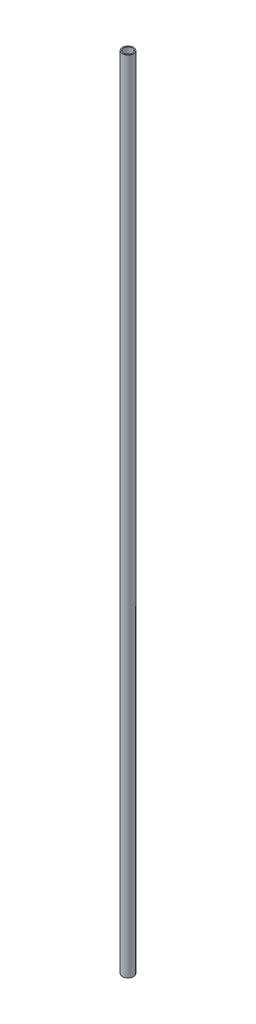
ISO-10303-21;
HEADER;
FILE_DESCRIPTION(('STEP AP214'),'2;1');
FILE_NAME('part.step','',(''),(''),'','','');
FILE_SCHEMA(('AUTOMOTIVE_DESIGN { 1 0 10303 214 1 1 1 1 }'));
ENDSEC;
DATA;
#1=APPLICATION_CONTEXT('core data for automotive mechanical design processes');
#2=APPLICATION_PROTOCOL_DEFINITION('international standard','automotive_design',2000,#1);
#3=PRODUCT_CONTEXT('',#1,'mechanical');
#4=PRODUCT('Part','Part','',(#3));
#5=PRODUCT_RELATED_PRODUCT_CATEGORY('part','',(#4));
#6=PRODUCT_DEFINITION_FORMATION('','',#4);
#7=PRODUCT_DEFINITION_CONTEXT('part definition',#1,'design');
#8=PRODUCT_DEFINITION('design','',#6,#7);
#9=PRODUCT_DEFINITION_SHAPE('','',#8);
#10=(LENGTH_UNIT() NAMED_UNIT(*) SI_UNIT(.MILLI.,.METRE.));
#11=(NAMED_UNIT(*) PLANE_ANGLE_UNIT() SI_UNIT($,.RADIAN.));
#12=(NAMED_UNIT(*) SI_UNIT($,.STERADIAN.) SOLID_ANGLE_UNIT());
#13=UNCERTAINTY_MEASURE_WITH_UNIT(LENGTH_MEASURE(1.E-05),#10,'distance_accuracy_value','');
#14=(GEOMETRIC_REPRESENTATION_CONTEXT(3) GLOBAL_UNCERTAINTY_ASSIGNED_CONTEXT((#13)) GLOBAL_UNIT_ASSIGNED_CONTEXT((#10,
#11,#12)) REPRESENTATION_CONTEXT('',''));
#15=CARTESIAN_POINT('',(0.,0.,0.));
#16=DIRECTION('',(0.,0.,1.));
#17=DIRECTION('',(1.,0.,0.));
#18=AXIS2_PLACEMENT_3D('',#15,#16,#17);
#19=CARTESIAN_POINT('',(0.,914.4,0.));
#20=DIRECTION('',(0.,1.,0.));
#21=DIRECTION('',(0.,0.,1.));
#22=AXIS2_PLACEMENT_3D('',#19,#20,#21);
#23=PLANE('',#22);
#24=CARTESIAN_POINT('',(0.,914.4,0.));
#25=DIRECTION('',(0.,1.,0.));
#26=DIRECTION('',(0.,0.,1.));
#27=AXIS2_PLACEMENT_3D('',#24,#25,#26);
#28=CIRCLE('',#27,6.35);
#29=CARTESIAN_POINT('',(0.,914.4,-6.35));
#30=VERTEX_POINT('',#29);
#31=EDGE_CURVE('E10',#30,#30,#28,.T.);
#32=ORIENTED_EDGE('',*,*,#31,.T.);
#33=EDGE_LOOP('',(#32));
#34=FACE_BOUND('',#33,.T.);
#35=CARTESIAN_POINT('',(0.,914.4,0.));
#36=DIRECTION('',(0.,1.,0.));
#37=DIRECTION('',(0.,0.,1.));
#38=AXIS2_PLACEMENT_3D('',#35,#36,#37);
#39=CIRCLE('',#38,5.1054);
#40=CARTESIAN_POINT('',(0.,914.4,-5.1054));
#41=VERTEX_POINT('',#40);
#42=EDGE_CURVE('E46',#41,#41,#39,.T.);
#43=ORIENTED_EDGE('',*,*,#42,.F.);
#44=EDGE_LOOP('',(#43));
#45=FACE_BOUND('',#44,.T.);
#46=ADVANCED_FACE('F35',(#34,#45),#23,.T.);
#47=CARTESIAN_POINT('',(0.,0.,0.));
#48=DIRECTION('',(0.,1.,0.));
#49=DIRECTION('',(0.,0.,1.));
#50=AXIS2_PLACEMENT_3D('',#47,#48,#49);
#51=PLANE('',#50);
#52=CARTESIAN_POINT('',(0.,0.,0.));
#53=DIRECTION('',(0.,1.,0.));
#54=DIRECTION('',(0.,0.,1.));
#55=AXIS2_PLACEMENT_3D('',#52,#53,#54);
#56=CIRCLE('',#55,6.35);
#57=CARTESIAN_POINT('',(0.,-1.11022302462516E-13,-6.35));
#58=VERTEX_POINT('',#57);
#59=EDGE_CURVE('E39',#58,#58,#56,.T.);
#60=ORIENTED_EDGE('',*,*,#59,.F.);
#61=EDGE_LOOP('',(#60));
#62=FACE_BOUND('',#61,.T.);
#63=CARTESIAN_POINT('',(0.,0.,0.));
#64=DIRECTION('',(0.,1.,0.));
#65=DIRECTION('',(0.,0.,1.));
#66=AXIS2_PLACEMENT_3D('',#63,#64,#65);
#67=CIRCLE('',#66,5.1054);
#68=CARTESIAN_POINT('',(0.,-1.11022302462516E-13,-5.1054));
#69=VERTEX_POINT('',#68);
#70=EDGE_CURVE('E48',#69,#69,#67,.T.);
#71=ORIENTED_EDGE('',*,*,#70,.T.);
#72=EDGE_LOOP('',(#71));
#73=FACE_BOUND('',#72,.T.);
#74=ADVANCED_FACE('F58',(#62,#73),#51,.F.);
#75=CARTESIAN_POINT('',(0.,914.4,0.));
#76=DIRECTION('',(0.,-1.,0.));
#77=DIRECTION('',(0.,0.,-1.));
#78=AXIS2_PLACEMENT_3D('',#75,#76,#77);
#79=CYLINDRICAL_SURFACE('',#78,6.35);
#80=CARTESIAN_POINT('',(0.,914.4,-6.35));
#81=CARTESIAN_POINT('',(0.,904.875,-6.35));
#82=CARTESIAN_POINT('',(0.,895.35,-6.35));
#83=CARTESIAN_POINT('',(0.,876.3,-6.35));
#84=CARTESIAN_POINT('',(0.,866.775,-6.35));
#85=CARTESIAN_POINT('',(0.,847.725,-6.35));
#86=CARTESIAN_POINT('',(0.,838.2,-6.35));
#87=CARTESIAN_POINT('',(0.,819.15,-6.35));
#88=CARTESIAN_POINT('',(0.,809.625,-6.35));
#89=CARTESIAN_POINT('',(0.,790.575,-6.35));
#90=CARTESIAN_POINT('',(0.,781.05,-6.35));
#91=CARTESIAN_POINT('',(0.,762.,-6.35));
#92=CARTESIAN_POINT('',(0.,752.475,-6.35));
#93=CARTESIAN_POINT('',(0.,733.425,-6.35));
#94=CARTESIAN_POINT('',(0.,723.9,-6.35));
#95=CARTESIAN_POINT('',(0.,704.85,-6.35));
#96=CARTESIAN_POINT('',(0.,695.325,-6.35));
#97=CARTESIAN_POINT('',(0.,676.275,-6.35));
#98=CARTESIAN_POINT('',(0.,666.75,-6.35));
#99=CARTESIAN_POINT('',(0.,647.7,-6.35));
#100=CARTESIAN_POINT('',(0.,638.175,-6.35));
#101=CARTESIAN_POINT('',(0.,619.125,-6.35));
#102=CARTESIAN_POINT('',(0.,609.6,-6.35));
#103=CARTESIAN_POINT('',(0.,590.55,-6.35));
#104=CARTESIAN_POINT('',(0.,581.025,-6.35));
#105=CARTESIAN_POINT('',(0.,561.975,-6.35));
#106=CARTESIAN_POINT('',(0.,552.45,-6.35));
#107=CARTESIAN_POINT('',(0.,533.4,-6.35));
#108=CARTESIAN_POINT('',(0.,523.875,-6.35));
#109=CARTESIAN_POINT('',(0.,504.825,-6.35));
#110=CARTESIAN_POINT('',(0.,495.3,-6.35));
#111=CARTESIAN_POINT('',(0.,476.25,-6.35));
#112=CARTESIAN_POINT('',(0.,466.725,-6.35));
#113=CARTESIAN_POINT('',(0.,447.675,-6.35));
#114=CARTESIAN_POINT('',(0.,438.15,-6.35));
#115=CARTESIAN_POINT('',(0.,419.1,-6.35));
#116=CARTESIAN_POINT('',(0.,409.575,-6.35));
#117=CARTESIAN_POINT('',(0.,390.525,-6.35));
#118=CARTESIAN_POINT('',(0.,381.,-6.35));
#119=CARTESIAN_POINT('',(0.,361.95,-6.35));
#120=CARTESIAN_POINT('',(0.,352.425,-6.35));
#121=CARTESIAN_POINT('',(0.,333.375,-6.35));
#122=CARTESIAN_POINT('',(0.,323.85,-6.35));
#123=CARTESIAN_POINT('',(0.,304.8,-6.35));
#124=CARTESIAN_POINT('',(0.,295.275,-6.35));
#125=CARTESIAN_POINT('',(0.,276.225,-6.35));
#126=CARTESIAN_POINT('',(0.,266.7,-6.35));
#127=CARTESIAN_POINT('',(0.,247.65,-6.35));
#128=CARTESIAN_POINT('',(0.,238.125,-6.35));
#129=CARTESIAN_POINT('',(0.,219.075,-6.35));
#130=CARTESIAN_POINT('',(0.,209.55,-6.35));
#131=CARTESIAN_POINT('',(0.,190.5,-6.35));
#132=CARTESIAN_POINT('',(0.,180.975,-6.35));
#133=CARTESIAN_POINT('',(0.,161.925,-6.35));
#134=CARTESIAN_POINT('',(0.,152.4,-6.35));
#135=CARTESIAN_POINT('',(0.,133.35,-6.35));
#136=CARTESIAN_POINT('',(0.,123.825,-6.35));
#137=CARTESIAN_POINT('',(0.,104.775,-6.35));
#138=CARTESIAN_POINT('',(0.,95.2499999999999,-6.35));
#139=CARTESIAN_POINT('',(0.,76.1999999999999,-6.35));
#140=CARTESIAN_POINT('',(0.,66.6749999999999,-6.35));
#141=CARTESIAN_POINT('',(0.,47.6249999999999,-6.35));
#142=CARTESIAN_POINT('',(0.,38.0999999999999,-6.35));
#143=CARTESIAN_POINT('',(0.,19.0499999999999,-6.35));
#144=CARTESIAN_POINT('',(0.,9.52499999999988,-6.35));
#145=CARTESIAN_POINT('',(0.,-1.11022302462516E-13,-6.35));
#146=B_SPLINE_CURVE_WITH_KNOTS('',3,(#80,#81,#82,#83,#84,#85,#86,#87,#88,#89,#90,#91,#92,#93,
#94,#95,#96,#97,#98,#99,#100,#101,#102,#103,#104,#105,#106,#107,#108,#109,#110,#111,#112,#113,
#114,#115,#116,#117,#118,#119,#120,#121,#122,#123,#124,#125,#126,#127,#128,#129,#130,#131,#132,
#133,#134,#135,#136,#137,#138,#139,#140,#141,#142,#143,#144,#145),.UNSPECIFIED.,.F.,.F.,(4,2,2,
2,2,2,2,2,2,2,2,2,2,2,2,2,2,2,2,2,2,2,2,2,2,2,2,2,2,2,2,2,4),(0.,28.575,57.15,85.7250000000001,
114.3,142.875,171.45,200.025,228.6,257.175,285.75,314.325,342.9,371.475,400.05,428.625,457.2,
485.775,514.35,542.925,571.5,600.075,628.65,657.225,685.8,714.375,742.95,771.525,800.1,828.675,
857.25,885.825,914.4),.UNSPECIFIED.);
#147=EDGE_CURVE('BSEAM37',#30,#58,#146,.T.);
#148=ORIENTED_EDGE('',*,*,#31,.F.);
#149=ORIENTED_EDGE('',*,*,#59,.T.);
#150=ORIENTED_EDGE('',*,*,#147,.T.);
#151=ORIENTED_EDGE('',*,*,#147,.F.);
#152=EDGE_LOOP('',(#148,#150,#149,#151));
#153=FACE_BOUND('',#152,.T.);
#154=ADVANCED_FACE('F37',(#153),#79,.T.);
#155=CARTESIAN_POINT('',(0.,914.4,0.));
#156=DIRECTION('',(0.,-1.,0.));
#157=DIRECTION('',(0.,0.,-1.));
#158=AXIS2_PLACEMENT_3D('',#155,#156,#157);
#159=CYLINDRICAL_SURFACE('',#158,5.1054);
#160=CARTESIAN_POINT('',(0.,914.4,-5.1054));
#161=CARTESIAN_POINT('',(0.,904.875,-5.1054));
#162=CARTESIAN_POINT('',(0.,895.35,-5.1054));
#163=CARTESIAN_POINT('',(0.,876.3,-5.1054));
#164=CARTESIAN_POINT('',(0.,866.775,-5.1054));
#165=CARTESIAN_POINT('',(0.,847.725,-5.1054));
#166=CARTESIAN_POINT('',(0.,838.2,-5.1054));
#167=CARTESIAN_POINT('',(0.,819.15,-5.1054));
#168=CARTESIAN_POINT('',(0.,809.625,-5.1054));
#169=CARTESIAN_POINT('',(0.,790.575,-5.1054));
#170=CARTESIAN_POINT('',(0.,781.05,-5.1054));
#171=CARTESIAN_POINT('',(0.,762.,-5.1054));
#172=CARTESIAN_POINT('',(0.,752.475,-5.1054));
#173=CARTESIAN_POINT('',(0.,733.425,-5.1054));
#174=CARTESIAN_POINT('',(0.,723.9,-5.1054));
#175=CARTESIAN_POINT('',(0.,704.85,-5.1054));
#176=CARTESIAN_POINT('',(0.,695.325,-5.1054));
#177=CARTESIAN_POINT('',(0.,676.275,-5.1054));
#178=CARTESIAN_POINT('',(0.,666.75,-5.1054));
#179=CARTESIAN_POINT('',(0.,647.7,-5.1054));
#180=CARTESIAN_POINT('',(0.,638.175,-5.1054));
#181=CARTESIAN_POINT('',(0.,619.125,-5.1054));
#182=CARTESIAN_POINT('',(0.,609.6,-5.1054));
#183=CARTESIAN_POINT('',(0.,590.55,-5.1054));
#184=CARTESIAN_POINT('',(0.,581.025,-5.1054));
#185=CARTESIAN_POINT('',(0.,561.975,-5.1054));
#186=CARTESIAN_POINT('',(0.,552.45,-5.1054));
#187=CARTESIAN_POINT('',(0.,533.4,-5.1054));
#188=CARTESIAN_POINT('',(0.,523.875,-5.1054));
#189=CARTESIAN_POINT('',(0.,504.825,-5.1054));
#190=CARTESIAN_POINT('',(0.,495.3,-5.1054));
#191=CARTESIAN_POINT('',(0.,476.25,-5.1054));
#192=CARTESIAN_POINT('',(0.,466.725,-5.1054));
#193=CARTESIAN_POINT('',(0.,447.675,-5.1054));
#194=CARTESIAN_POINT('',(0.,438.15,-5.1054));
#195=CARTESIAN_POINT('',(0.,419.1,-5.1054));
#196=CARTESIAN_POINT('',(0.,409.575,-5.1054));
#197=CARTESIAN_POINT('',(0.,390.525,-5.1054));
#198=CARTESIAN_POINT('',(0.,381.,-5.1054));
#199=CARTESIAN_POINT('',(0.,361.95,-5.1054));
#200=CARTESIAN_POINT('',(0.,352.425,-5.1054));
#201=CARTESIAN_POINT('',(0.,333.375,-5.1054));
#202=CARTESIAN_POINT('',(0.,323.85,-5.1054));
#203=CARTESIAN_POINT('',(0.,304.8,-5.1054));
#204=CARTESIAN_POINT('',(0.,295.275,-5.1054));
#205=CARTESIAN_POINT('',(0.,276.225,-5.1054));
#206=CARTESIAN_POINT('',(0.,266.7,-5.1054));
#207=CARTESIAN_POINT('',(0.,247.65,-5.1054));
#208=CARTESIAN_POINT('',(0.,238.125,-5.1054));
#209=CARTESIAN_POINT('',(0.,219.075,-5.1054));
#210=CARTESIAN_POINT('',(0.,209.55,-5.1054));
#211=CARTESIAN_POINT('',(0.,190.5,-5.1054));
#212=CARTESIAN_POINT('',(0.,180.975,-5.1054));
#213=CARTESIAN_POINT('',(0.,161.925,-5.1054));
#214=CARTESIAN_POINT('',(0.,152.4,-5.1054));
#215=CARTESIAN_POINT('',(0.,133.35,-5.1054));
#216=CARTESIAN_POINT('',(0.,123.825,-5.1054));
#217=CARTESIAN_POINT('',(0.,104.775,-5.1054));
#218=CARTESIAN_POINT('',(0.,95.2499999999999,-5.1054));
#219=CARTESIAN_POINT('',(0.,76.1999999999999,-5.1054));
#220=CARTESIAN_POINT('',(0.,66.6749999999999,-5.1054));
#221=CARTESIAN_POINT('',(0.,47.6249999999999,-5.1054));
#222=CARTESIAN_POINT('',(0.,38.0999999999999,-5.1054));
#223=CARTESIAN_POINT('',(0.,19.0499999999999,-5.1054));
#224=CARTESIAN_POINT('',(0.,9.52499999999988,-5.1054));
#225=CARTESIAN_POINT('',(0.,-1.11022302462516E-13,-5.1054));
#226=B_SPLINE_CURVE_WITH_KNOTS('',3,(#160,#161,#162,#163,#164,#165,#166,#167,#168,#169,#170,
#171,#172,#173,#174,#175,#176,#177,#178,#179,#180,#181,#182,#183,#184,#185,#186,#187,#188,#189,
#190,#191,#192,#193,#194,#195,#196,#197,#198,#199,#200,#201,#202,#203,#204,#205,#206,#207,#208,
#209,#210,#211,#212,#213,#214,#215,#216,#217,#218,#219,#220,#221,#222,#223,#224,#225),
.UNSPECIFIED.,.F.,.F.,(4,2,2,2,2,2,2,2,2,2,2,2,2,2,2,2,2,2,2,2,2,2,2,2,2,2,2,2,2,2,2,2,4),(0.,
28.575,57.15,85.7250000000001,114.3,142.875,171.45,200.025,228.6,257.175,285.75,314.325,342.9,
371.475,400.05,428.625,457.2,485.775,514.35,542.925,571.5,600.075,628.65,657.225,685.8,714.375,
742.95,771.525,800.1,828.675,857.25,885.825,914.4),.UNSPECIFIED.);
#227=EDGE_CURVE('BSEAM54',#41,#69,#226,.T.);
#228=ORIENTED_EDGE('',*,*,#42,.T.);
#229=ORIENTED_EDGE('',*,*,#70,.F.);
#230=ORIENTED_EDGE('',*,*,#227,.T.);
#231=ORIENTED_EDGE('',*,*,#227,.F.);
#232=EDGE_LOOP('',(#228,#230,#229,#231));
#233=FACE_BOUND('',#232,.T.);
#234=ADVANCED_FACE('F54',(#233),#159,.F.);
#235=CLOSED_SHELL('',(#46,#74,#154,#234));
#236=MANIFOLD_SOLID_BREP('B2',#235);
#237=ADVANCED_BREP_SHAPE_REPRESENTATION('',(#18,#236),#14);
#238=SHAPE_DEFINITION_REPRESENTATION(#9,#237);
ENDSEC;
END-ISO-10303-21;
